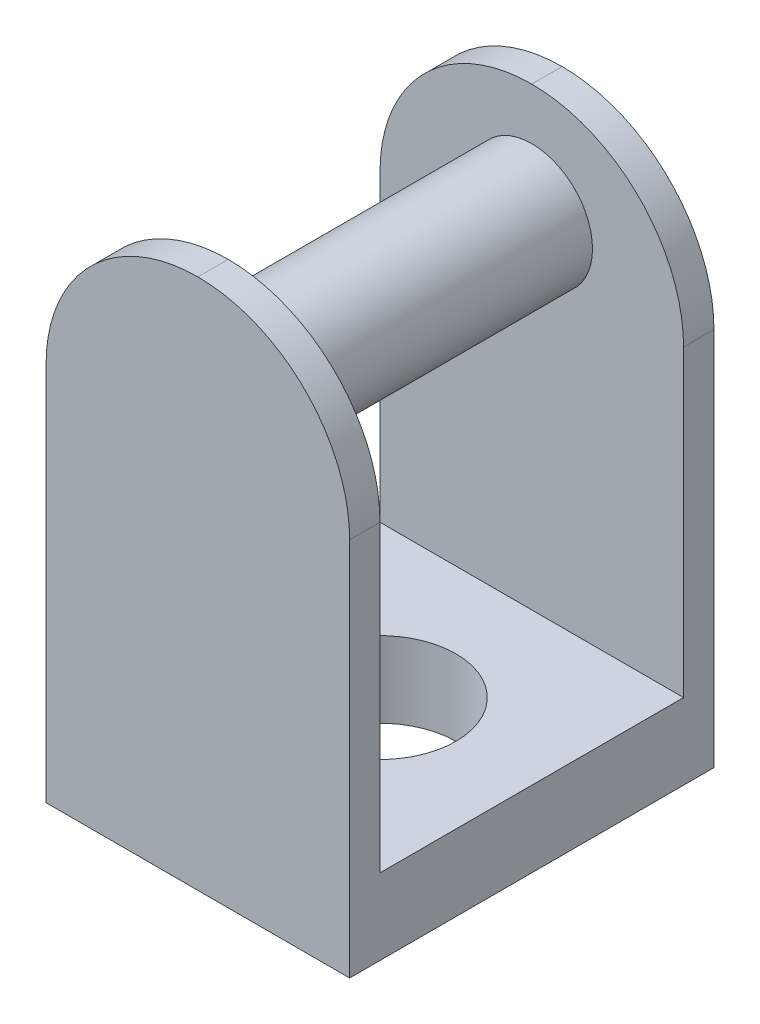
ISO-10303-21;
HEADER;
FILE_DESCRIPTION(('STEP AP214'),'2;1');
FILE_NAME('part.step','',(''),(''),'','','');
FILE_SCHEMA(('AUTOMOTIVE_DESIGN { 1 0 10303 214 1 1 1 1 }'));
ENDSEC;
DATA;
#1=APPLICATION_CONTEXT('core data for automotive mechanical design processes');
#2=APPLICATION_PROTOCOL_DEFINITION('international standard','automotive_design',2000,#1);
#3=PRODUCT_CONTEXT('',#1,'mechanical');
#4=PRODUCT('Part','Part','',(#3));
#5=PRODUCT_RELATED_PRODUCT_CATEGORY('part','',(#4));
#6=PRODUCT_DEFINITION_FORMATION('','',#4);
#7=PRODUCT_DEFINITION_CONTEXT('part definition',#1,'design');
#8=PRODUCT_DEFINITION('design','',#6,#7);
#9=PRODUCT_DEFINITION_SHAPE('','',#8);
#10=(LENGTH_UNIT() NAMED_UNIT(*) SI_UNIT(.MILLI.,.METRE.));
#11=(NAMED_UNIT(*) PLANE_ANGLE_UNIT() SI_UNIT($,.RADIAN.));
#12=(NAMED_UNIT(*) SI_UNIT($,.STERADIAN.) SOLID_ANGLE_UNIT());
#13=UNCERTAINTY_MEASURE_WITH_UNIT(LENGTH_MEASURE(1.E-05),#10,'distance_accuracy_value','');
#14=(GEOMETRIC_REPRESENTATION_CONTEXT(3) GLOBAL_UNCERTAINTY_ASSIGNED_CONTEXT((#13)) GLOBAL_UNIT_ASSIGNED_CONTEXT((#10,
#11,#12)) REPRESENTATION_CONTEXT('',''));
#15=CARTESIAN_POINT('',(0.,0.,0.));
#16=DIRECTION('',(0.,0.,1.));
#17=DIRECTION('',(1.,0.,0.));
#18=AXIS2_PLACEMENT_3D('',#15,#16,#17);
#19=CARTESIAN_POINT('',(-10.,35.,10.));
#20=DIRECTION('',(0.,0.,1.));
#21=DIRECTION('',(1.,0.,0.));
#22=AXIS2_PLACEMENT_3D('',#19,#20,#21);
#23=PLANE('',#22);
#24=CARTESIAN_POINT('',(0.,25.,10.));
#25=DIRECTION('',(0.,0.,1.));
#26=DIRECTION('',(1.,0.,0.));
#27=AXIS2_PLACEMENT_3D('',#24,#25,#26);
#28=CIRCLE('',#27,10.);
#29=CARTESIAN_POINT('',(-10.,25.,10.));
#30=VERTEX_POINT('',#29);
#31=CARTESIAN_POINT('',(0.,35.,10.));
#32=VERTEX_POINT('',#31);
#33=EDGE_CURVE('E219',#30,#32,#28,.F.);
#34=ORIENTED_EDGE('',*,*,#33,.T.);
#35=CARTESIAN_POINT('',(0.,25.,10.));
#36=DIRECTION('',(0.,0.,1.));
#37=DIRECTION('',(1.,0.,0.));
#38=AXIS2_PLACEMENT_3D('',#35,#36,#37);
#39=CIRCLE('',#38,10.);
#40=CARTESIAN_POINT('',(10.,25.,10.));
#41=VERTEX_POINT('',#40);
#42=EDGE_CURVE('E222',#32,#41,#39,.F.);
#43=ORIENTED_EDGE('',*,*,#42,.T.);
#44=DIRECTION('',(0.,-1.,0.));
#45=VECTOR('',#44,1.);
#46=CARTESIAN_POINT('',(10.,35.,10.));
#47=LINE('',#46,#45);
#48=CARTESIAN_POINT('',(10.,5.,10.));
#49=VERTEX_POINT('',#48);
#50=EDGE_CURVE('E151',#41,#49,#47,.T.);
#51=ORIENTED_EDGE('',*,*,#50,.T.);
#52=DIRECTION('',(1.,0.,0.));
#53=VECTOR('',#52,1.);
#54=CARTESIAN_POINT('',(-10.,5.,10.));
#55=LINE('',#54,#53);
#56=CARTESIAN_POINT('',(-10.,5.,10.));
#57=VERTEX_POINT('',#56);
#58=EDGE_CURVE('E184',#57,#49,#55,.T.);
#59=ORIENTED_EDGE('',*,*,#58,.F.);
#60=DIRECTION('',(0.,-1.,0.));
#61=VECTOR('',#60,1.);
#62=CARTESIAN_POINT('',(-10.,35.,10.));
#63=LINE('',#62,#61);
#64=EDGE_CURVE('E155',#30,#57,#63,.T.);
#65=ORIENTED_EDGE('',*,*,#64,.F.);
#66=EDGE_LOOP('',(#34,#43,#51,#59,#65));
#67=FACE_BOUND('',#66,.T.);
#68=CARTESIAN_POINT('',(0.,27.6040719293746,10.));
#69=DIRECTION('',(0.,0.,1.));
#70=DIRECTION('',(1.,0.,0.));
#71=AXIS2_PLACEMENT_3D('',#68,#69,#70);
#72=CIRCLE('',#71,4.);
#73=CARTESIAN_POINT('',(4.,27.6040719293746,10.));
#74=VERTEX_POINT('',#73);
#75=EDGE_CURVE('E11',#74,#74,#72,.F.);
#76=ORIENTED_EDGE('',*,*,#75,.F.);
#77=EDGE_LOOP('',(#76));
#78=FACE_BOUND('',#77,.T.);
#79=ADVANCED_FACE('F33',(#67,#78),#23,.F.);
#80=CARTESIAN_POINT('',(10.,35.,-10.));
#81=DIRECTION('',(0.,0.,-1.));
#82=DIRECTION('',(-1.,0.,0.));
#83=AXIS2_PLACEMENT_3D('',#80,#81,#82);
#84=PLANE('',#83);
#85=DIRECTION('',(0.,-1.,0.));
#86=VECTOR('',#85,1.);
#87=CARTESIAN_POINT('',(10.,35.,-10.));
#88=LINE('',#87,#86);
#89=CARTESIAN_POINT('',(10.,25.,-10.));
#90=VERTEX_POINT('',#89);
#91=CARTESIAN_POINT('',(10.,5.,-10.));
#92=VERTEX_POINT('',#91);
#93=EDGE_CURVE('E136',#90,#92,#88,.T.);
#94=ORIENTED_EDGE('',*,*,#93,.F.);
#95=CARTESIAN_POINT('',(0.,25.,-10.));
#96=DIRECTION('',(0.,0.,-1.));
#97=DIRECTION('',(-1.,0.,0.));
#98=AXIS2_PLACEMENT_3D('',#95,#96,#97);
#99=CIRCLE('',#98,10.);
#100=CARTESIAN_POINT('',(0.,35.,-10.));
#101=VERTEX_POINT('',#100);
#102=EDGE_CURVE('E217',#90,#101,#99,.F.);
#103=ORIENTED_EDGE('',*,*,#102,.T.);
#104=CARTESIAN_POINT('',(0.,25.,-10.));
#105=DIRECTION('',(0.,0.,-1.));
#106=DIRECTION('',(-1.,0.,0.));
#107=AXIS2_PLACEMENT_3D('',#104,#105,#106);
#108=CIRCLE('',#107,10.);
#109=CARTESIAN_POINT('',(-10.,25.,-10.));
#110=VERTEX_POINT('',#109);
#111=EDGE_CURVE('E213',#101,#110,#108,.F.);
#112=ORIENTED_EDGE('',*,*,#111,.T.);
#113=DIRECTION('',(0.,-1.,0.));
#114=VECTOR('',#113,1.);
#115=CARTESIAN_POINT('',(-10.,35.,-10.));
#116=LINE('',#115,#114);
#117=CARTESIAN_POINT('',(-10.,5.,-10.));
#118=VERTEX_POINT('',#117);
#119=EDGE_CURVE('E120',#110,#118,#116,.T.);
#120=ORIENTED_EDGE('',*,*,#119,.T.);
#121=DIRECTION('',(-1.,0.,0.));
#122=VECTOR('',#121,1.);
#123=CARTESIAN_POINT('',(-10.,5.,-10.));
#124=LINE('',#123,#122);
#125=EDGE_CURVE('E177',#92,#118,#124,.T.);
#126=ORIENTED_EDGE('',*,*,#125,.F.);
#127=EDGE_LOOP('',(#94,#103,#112,#120,#126));
#128=FACE_BOUND('',#127,.T.);
#129=CARTESIAN_POINT('',(0.,27.6040719293746,-10.));
#130=DIRECTION('',(0.,0.,-1.));
#131=DIRECTION('',(-1.,0.,0.));
#132=AXIS2_PLACEMENT_3D('',#129,#130,#131);
#133=CIRCLE('',#132,4.);
#134=CARTESIAN_POINT('',(-4.,27.6040719293746,-10.));
#135=VERTEX_POINT('',#134);
#136=EDGE_CURVE('E41',#135,#135,#133,.F.);
#137=ORIENTED_EDGE('',*,*,#136,.F.);
#138=EDGE_LOOP('',(#137));
#139=FACE_BOUND('',#138,.T.);
#140=ADVANCED_FACE('F210',(#128,#139),#84,.F.);
#141=CARTESIAN_POINT('',(0.,5.,0.));
#142=DIRECTION('',(0.,1.,0.));
#143=DIRECTION('',(0.,0.,1.));
#144=AXIS2_PLACEMENT_3D('',#141,#142,#143);
#145=PLANE('',#144);
#146=DIRECTION('',(0.,0.,-1.));
#147=VECTOR('',#146,1.);
#148=CARTESIAN_POINT('',(10.,5.,-10.));
#149=LINE('',#148,#147);
#150=EDGE_CURVE('E130',#49,#92,#149,.T.);
#151=ORIENTED_EDGE('',*,*,#150,.T.);
#152=ORIENTED_EDGE('',*,*,#125,.T.);
#153=DIRECTION('',(0.,0.,1.));
#154=VECTOR('',#153,1.);
#155=CARTESIAN_POINT('',(-10.,5.,-10.));
#156=LINE('',#155,#154);
#157=EDGE_CURVE('E180',#118,#57,#156,.T.);
#158=ORIENTED_EDGE('',*,*,#157,.T.);
#159=ORIENTED_EDGE('',*,*,#58,.T.);
#160=EDGE_LOOP('',(#151,#152,#158,#159));
#161=FACE_BOUND('',#160,.T.);
#162=CARTESIAN_POINT('',(0.,5.,0.));
#163=DIRECTION('',(0.,1.,0.));
#164=DIRECTION('',(0.,0.,1.));
#165=AXIS2_PLACEMENT_3D('',#162,#163,#164);
#166=CIRCLE('',#165,5.);
#167=CARTESIAN_POINT('',(0.,5.,5.));
#168=VERTEX_POINT('',#167);
#169=EDGE_CURVE('E167',#168,#168,#166,.T.);
#170=ORIENTED_EDGE('',*,*,#169,.F.);
#171=EDGE_LOOP('',(#170));
#172=FACE_BOUND('',#171,.T.);
#173=ADVANCED_FACE('F196',(#161,#172),#145,.T.);
#174=CARTESIAN_POINT('',(0.,0.,0.));
#175=DIRECTION('',(0.,1.,0.));
#176=DIRECTION('',(0.,0.,1.));
#177=AXIS2_PLACEMENT_3D('',#174,#175,#176);
#178=PLANE('',#177);
#179=DIRECTION('',(0.,0.,-1.));
#180=VECTOR('',#179,1.);
#181=CARTESIAN_POINT('',(10.,0.,-10.));
#182=LINE('',#181,#180);
#183=CARTESIAN_POINT('',(10.,0.,12.));
#184=VERTEX_POINT('',#183);
#185=CARTESIAN_POINT('',(10.,0.,-12.));
#186=VERTEX_POINT('',#185);
#187=EDGE_CURVE('E131',#184,#186,#182,.T.);
#188=ORIENTED_EDGE('',*,*,#187,.F.);
#189=DIRECTION('',(-1.,0.,0.));
#190=VECTOR('',#189,1.);
#191=CARTESIAN_POINT('',(-10.,0.,12.));
#192=LINE('',#191,#190);
#193=CARTESIAN_POINT('',(-10.,0.,12.));
#194=VERTEX_POINT('',#193);
#195=EDGE_CURVE('E129',#184,#194,#192,.T.);
#196=ORIENTED_EDGE('',*,*,#195,.T.);
#197=DIRECTION('',(0.,0.,1.));
#198=VECTOR('',#197,1.);
#199=CARTESIAN_POINT('',(-10.,0.,-10.));
#200=LINE('',#199,#198);
#201=CARTESIAN_POINT('',(-10.,0.,-12.));
#202=VERTEX_POINT('',#201);
#203=EDGE_CURVE('E111',#202,#194,#200,.T.);
#204=ORIENTED_EDGE('',*,*,#203,.F.);
#205=DIRECTION('',(1.,0.,0.));
#206=VECTOR('',#205,1.);
#207=CARTESIAN_POINT('',(10.,0.,-12.));
#208=LINE('',#207,#206);
#209=EDGE_CURVE('E127',#202,#186,#208,.T.);
#210=ORIENTED_EDGE('',*,*,#209,.T.);
#211=EDGE_LOOP('',(#188,#196,#204,#210));
#212=FACE_BOUND('',#211,.T.);
#213=CARTESIAN_POINT('',(0.,0.,0.));
#214=DIRECTION('',(0.,1.,0.));
#215=DIRECTION('',(0.,0.,1.));
#216=AXIS2_PLACEMENT_3D('',#213,#214,#215);
#217=CIRCLE('',#216,5.);
#218=CARTESIAN_POINT('',(0.,0.,5.));
#219=VERTEX_POINT('',#218);
#220=EDGE_CURVE('E166',#219,#219,#217,.T.);
#221=ORIENTED_EDGE('',*,*,#220,.T.);
#222=EDGE_LOOP('',(#221));
#223=FACE_BOUND('',#222,.T.);
#224=ADVANCED_FACE('F125',(#212,#223),#178,.F.);
#225=CARTESIAN_POINT('',(10.,5.,-10.));
#226=DIRECTION('',(-1.,0.,0.));
#227=DIRECTION('',(0.,0.,1.));
#228=AXIS2_PLACEMENT_3D('',#225,#226,#227);
#229=PLANE('',#228);
#230=DIRECTION('',(0.,-1.,0.));
#231=VECTOR('',#230,1.);
#232=CARTESIAN_POINT('',(10.,35.,-12.));
#233=LINE('',#232,#231);
#234=CARTESIAN_POINT('',(10.,25.,-12.));
#235=VERTEX_POINT('',#234);
#236=EDGE_CURVE('E119',#235,#186,#233,.T.);
#237=ORIENTED_EDGE('',*,*,#236,.F.);
#238=DIRECTION('',(0.,0.,-1.));
#239=VECTOR('',#238,1.);
#240=CARTESIAN_POINT('',(10.,25.,-10.));
#241=LINE('',#240,#239);
#242=EDGE_CURVE('E208',#235,#90,#241,.F.);
#243=ORIENTED_EDGE('',*,*,#242,.T.);
#244=ORIENTED_EDGE('',*,*,#93,.T.);
#245=ORIENTED_EDGE('',*,*,#150,.F.);
#246=ORIENTED_EDGE('',*,*,#50,.F.);
#247=DIRECTION('',(0.,0.,-1.));
#248=VECTOR('',#247,1.);
#249=CARTESIAN_POINT('',(10.,25.,12.));
#250=LINE('',#249,#248);
#251=CARTESIAN_POINT('',(10.,25.,12.));
#252=VERTEX_POINT('',#251);
#253=EDGE_CURVE('E156',#41,#252,#250,.F.);
#254=ORIENTED_EDGE('',*,*,#253,.T.);
#255=DIRECTION('',(0.,-1.,0.));
#256=VECTOR('',#255,1.);
#257=CARTESIAN_POINT('',(10.,35.,12.));
#258=LINE('',#257,#256);
#259=EDGE_CURVE('E154',#252,#184,#258,.T.);
#260=ORIENTED_EDGE('',*,*,#259,.T.);
#261=ORIENTED_EDGE('',*,*,#187,.T.);
#262=EDGE_LOOP('',(#237,#243,#244,#245,#246,#254,#260,#261));
#263=FACE_BOUND('',#262,.T.);
#264=ADVANCED_FACE('F202',(#263),#229,.F.);
#265=CARTESIAN_POINT('',(-10.,5.,-10.));
#266=DIRECTION('',(1.,0.,0.));
#267=DIRECTION('',(0.,0.,-1.));
#268=AXIS2_PLACEMENT_3D('',#265,#266,#267);
#269=PLANE('',#268);
#270=DIRECTION('',(0.,-1.,0.));
#271=VECTOR('',#270,1.);
#272=CARTESIAN_POINT('',(-10.,35.,12.));
#273=LINE('',#272,#271);
#274=CARTESIAN_POINT('',(-10.,25.,12.));
#275=VERTEX_POINT('',#274);
#276=EDGE_CURVE('E164',#275,#194,#273,.T.);
#277=ORIENTED_EDGE('',*,*,#276,.F.);
#278=DIRECTION('',(0.,0.,1.));
#279=VECTOR('',#278,1.);
#280=CARTESIAN_POINT('',(-10.,25.,10.));
#281=LINE('',#280,#279);
#282=EDGE_CURVE('E227',#275,#30,#281,.F.);
#283=ORIENTED_EDGE('',*,*,#282,.T.);
#284=ORIENTED_EDGE('',*,*,#64,.T.);
#285=ORIENTED_EDGE('',*,*,#157,.F.);
#286=ORIENTED_EDGE('',*,*,#119,.F.);
#287=DIRECTION('',(0.,0.,1.));
#288=VECTOR('',#287,1.);
#289=CARTESIAN_POINT('',(-10.,25.,-12.));
#290=LINE('',#289,#288);
#291=CARTESIAN_POINT('',(-10.,25.,-12.));
#292=VERTEX_POINT('',#291);
#293=EDGE_CURVE('E115',#110,#292,#290,.F.);
#294=ORIENTED_EDGE('',*,*,#293,.T.);
#295=DIRECTION('',(0.,-1.,0.));
#296=VECTOR('',#295,1.);
#297=CARTESIAN_POINT('',(-10.,35.,-12.));
#298=LINE('',#297,#296);
#299=EDGE_CURVE('E108',#292,#202,#298,.T.);
#300=ORIENTED_EDGE('',*,*,#299,.T.);
#301=ORIENTED_EDGE('',*,*,#203,.T.);
#302=EDGE_LOOP('',(#277,#283,#284,#285,#286,#294,#300,#301));
#303=FACE_BOUND('',#302,.T.);
#304=ADVANCED_FACE('F110',(#303),#269,.F.);
#305=CARTESIAN_POINT('',(0.,5.,0.));
#306=DIRECTION('',(0.,-1.,0.));
#307=DIRECTION('',(0.,0.,-1.));
#308=AXIS2_PLACEMENT_3D('',#305,#306,#307);
#309=CYLINDRICAL_SURFACE('',#308,5.);
#310=ORIENTED_EDGE('',*,*,#169,.T.);
#311=EDGE_LOOP('',(#310));
#312=FACE_BOUND('',#311,.T.);
#313=ORIENTED_EDGE('',*,*,#220,.F.);
#314=EDGE_LOOP('',(#313));
#315=FACE_BOUND('',#314,.T.);
#316=ADVANCED_FACE('F252',(#312,#315),#309,.F.);
#317=CARTESIAN_POINT('',(-10.,35.,12.));
#318=DIRECTION('',(0.,0.,-1.));
#319=DIRECTION('',(-1.,0.,0.));
#320=AXIS2_PLACEMENT_3D('',#317,#318,#319);
#321=PLANE('',#320);
#322=ORIENTED_EDGE('',*,*,#259,.F.);
#323=CARTESIAN_POINT('',(0.,25.,12.));
#324=DIRECTION('',(0.,0.,-1.));
#325=DIRECTION('',(-1.,0.,0.));
#326=AXIS2_PLACEMENT_3D('',#323,#324,#325);
#327=CIRCLE('',#326,10.);
#328=CARTESIAN_POINT('',(0.,35.,12.));
#329=VERTEX_POINT('',#328);
#330=EDGE_CURVE('E48',#252,#329,#327,.F.);
#331=ORIENTED_EDGE('',*,*,#330,.T.);
#332=CARTESIAN_POINT('',(0.,25.,12.));
#333=DIRECTION('',(0.,0.,-1.));
#334=DIRECTION('',(-1.,0.,0.));
#335=AXIS2_PLACEMENT_3D('',#332,#333,#334);
#336=CIRCLE('',#335,10.);
#337=EDGE_CURVE('E52',#329,#275,#336,.F.);
#338=ORIENTED_EDGE('',*,*,#337,.T.);
#339=ORIENTED_EDGE('',*,*,#276,.T.);
#340=ORIENTED_EDGE('',*,*,#195,.F.);
#341=EDGE_LOOP('',(#322,#331,#338,#339,#340));
#342=FACE_BOUND('',#341,.T.);
#343=ADVANCED_FACE('F248',(#342),#321,.F.);
#344=CARTESIAN_POINT('',(10.,35.,-12.));
#345=DIRECTION('',(0.,0.,1.));
#346=DIRECTION('',(1.,0.,0.));
#347=AXIS2_PLACEMENT_3D('',#344,#345,#346);
#348=PLANE('',#347);
#349=CARTESIAN_POINT('',(0.,25.,-12.));
#350=DIRECTION('',(0.,0.,1.));
#351=DIRECTION('',(1.,0.,0.));
#352=AXIS2_PLACEMENT_3D('',#349,#350,#351);
#353=CIRCLE('',#352,10.);
#354=CARTESIAN_POINT('',(0.,35.,-12.));
#355=VERTEX_POINT('',#354);
#356=EDGE_CURVE('E183',#292,#355,#353,.F.);
#357=ORIENTED_EDGE('',*,*,#356,.T.);
#358=CARTESIAN_POINT('',(0.,25.,-12.));
#359=DIRECTION('',(0.,0.,1.));
#360=DIRECTION('',(1.,0.,0.));
#361=AXIS2_PLACEMENT_3D('',#358,#359,#360);
#362=CIRCLE('',#361,10.);
#363=EDGE_CURVE('E149',#355,#235,#362,.F.);
#364=ORIENTED_EDGE('',*,*,#363,.T.);
#365=ORIENTED_EDGE('',*,*,#236,.T.);
#366=ORIENTED_EDGE('',*,*,#209,.F.);
#367=ORIENTED_EDGE('',*,*,#299,.F.);
#368=EDGE_LOOP('',(#357,#364,#365,#366,#367));
#369=FACE_BOUND('',#368,.T.);
#370=ADVANCED_FACE('F133',(#369),#348,.F.);
#371=CARTESIAN_POINT('',(0.,25.,0.));
#372=DIRECTION('',(0.,0.,-1.));
#373=DIRECTION('',(-1.,0.,0.));
#374=AXIS2_PLACEMENT_3D('',#371,#372,#373);
#375=CYLINDRICAL_SURFACE('',#374,10.);
#376=ORIENTED_EDGE('',*,*,#293,.F.);
#377=ORIENTED_EDGE('',*,*,#111,.F.);
#378=DIRECTION('',(0.,0.,1.));
#379=VECTOR('',#378,1.);
#380=CARTESIAN_POINT('',(0.,35.,-10.));
#381=LINE('',#380,#379);
#382=EDGE_CURVE('E137',#355,#101,#381,.T.);
#383=ORIENTED_EDGE('',*,*,#382,.F.);
#384=ORIENTED_EDGE('',*,*,#356,.F.);
#385=EDGE_LOOP('',(#376,#377,#383,#384));
#386=FACE_BOUND('',#385,.T.);
#387=ADVANCED_FACE('F247',(#386),#375,.T.);
#388=CARTESIAN_POINT('',(0.,25.,0.));
#389=DIRECTION('',(0.,0.,1.));
#390=DIRECTION('',(1.,0.,0.));
#391=AXIS2_PLACEMENT_3D('',#388,#389,#390);
#392=CYLINDRICAL_SURFACE('',#391,10.);
#393=ORIENTED_EDGE('',*,*,#102,.F.);
#394=ORIENTED_EDGE('',*,*,#242,.F.);
#395=ORIENTED_EDGE('',*,*,#363,.F.);
#396=ORIENTED_EDGE('',*,*,#382,.T.);
#397=EDGE_LOOP('',(#393,#394,#395,#396));
#398=FACE_BOUND('',#397,.T.);
#399=ADVANCED_FACE('F261',(#398),#392,.T.);
#400=CARTESIAN_POINT('',(0.,25.,0.));
#401=DIRECTION('',(0.,0.,-1.));
#402=DIRECTION('',(-1.,0.,0.));
#403=AXIS2_PLACEMENT_3D('',#400,#401,#402);
#404=CYLINDRICAL_SURFACE('',#403,10.);
#405=ORIENTED_EDGE('',*,*,#282,.F.);
#406=ORIENTED_EDGE('',*,*,#337,.F.);
#407=DIRECTION('',(0.,0.,1.));
#408=VECTOR('',#407,1.);
#409=CARTESIAN_POINT('',(0.,35.,12.));
#410=LINE('',#409,#408);
#411=EDGE_CURVE('E141',#32,#329,#410,.T.);
#412=ORIENTED_EDGE('',*,*,#411,.F.);
#413=ORIENTED_EDGE('',*,*,#33,.F.);
#414=EDGE_LOOP('',(#405,#406,#412,#413));
#415=FACE_BOUND('',#414,.T.);
#416=ADVANCED_FACE('F35',(#415),#404,.T.);
#417=CARTESIAN_POINT('',(0.,25.,0.));
#418=DIRECTION('',(0.,0.,1.));
#419=DIRECTION('',(1.,0.,0.));
#420=AXIS2_PLACEMENT_3D('',#417,#418,#419);
#421=CYLINDRICAL_SURFACE('',#420,10.);
#422=ORIENTED_EDGE('',*,*,#330,.F.);
#423=ORIENTED_EDGE('',*,*,#253,.F.);
#424=ORIENTED_EDGE('',*,*,#42,.F.);
#425=ORIENTED_EDGE('',*,*,#411,.T.);
#426=EDGE_LOOP('',(#422,#423,#424,#425));
#427=FACE_BOUND('',#426,.T.);
#428=ADVANCED_FACE('F267',(#427),#421,.T.);
#429=CARTESIAN_POINT('',(0.,27.6040719293746,-21.3137084989848));
#430=DIRECTION('',(0.,0.,1.));
#431=DIRECTION('',(1.,0.,0.));
#432=AXIS2_PLACEMENT_3D('',#429,#430,#431);
#433=CYLINDRICAL_SURFACE('',#432,4.);
#434=ORIENTED_EDGE('',*,*,#75,.T.);
#435=EDGE_LOOP('',(#434));
#436=FACE_BOUND('',#435,.T.);
#437=ORIENTED_EDGE('',*,*,#136,.T.);
#438=EDGE_LOOP('',(#437));
#439=FACE_BOUND('',#438,.T.);
#440=ADVANCED_FACE('F233',(#436,#439),#433,.T.);
#441=CLOSED_SHELL('',(#79,#140,#173,#224,#264,#304,#316,#343,#370,#387,#399,#416,#428,#440));
#442=MANIFOLD_SOLID_BREP('B2',#441);
#443=ADVANCED_BREP_SHAPE_REPRESENTATION('',(#18,#442),#14);
#444=SHAPE_DEFINITION_REPRESENTATION(#9,#443);
ENDSEC;
END-ISO-10303-21;
